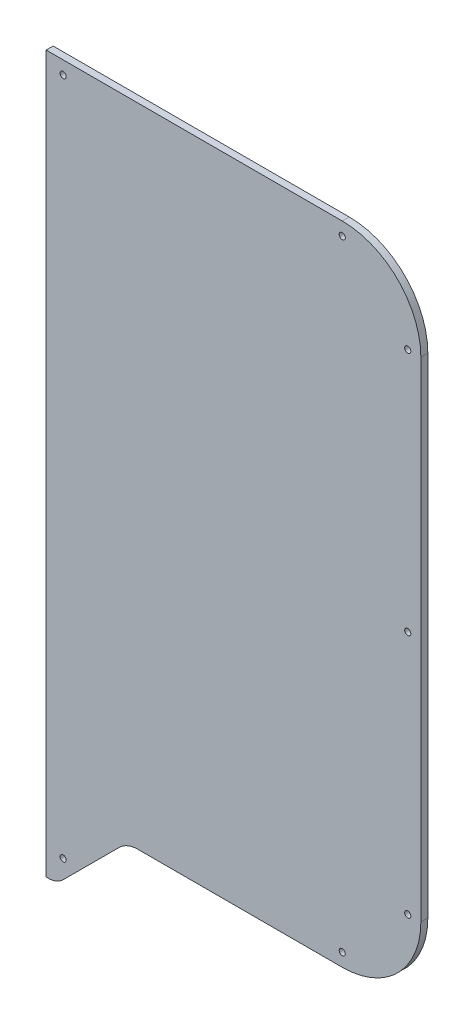
ISO-10303-21;
HEADER;
FILE_DESCRIPTION(('STEP AP214'),'2;1');
FILE_NAME('part.step','',(''),(''),'','','');
FILE_SCHEMA(('AUTOMOTIVE_DESIGN { 1 0 10303 214 1 1 1 1 }'));
ENDSEC;
DATA;
#1=APPLICATION_CONTEXT('core data for automotive mechanical design processes');
#2=APPLICATION_PROTOCOL_DEFINITION('international standard','automotive_design',2000,#1);
#3=PRODUCT_CONTEXT('',#1,'mechanical');
#4=PRODUCT('Part','Part','',(#3));
#5=PRODUCT_RELATED_PRODUCT_CATEGORY('part','',(#4));
#6=PRODUCT_DEFINITION_FORMATION('','',#4);
#7=PRODUCT_DEFINITION_CONTEXT('part definition',#1,'design');
#8=PRODUCT_DEFINITION('design','',#6,#7);
#9=PRODUCT_DEFINITION_SHAPE('','',#8);
#10=(LENGTH_UNIT() NAMED_UNIT(*) SI_UNIT(.MILLI.,.METRE.));
#11=(NAMED_UNIT(*) PLANE_ANGLE_UNIT() SI_UNIT($,.RADIAN.));
#12=(NAMED_UNIT(*) SI_UNIT($,.STERADIAN.) SOLID_ANGLE_UNIT());
#13=UNCERTAINTY_MEASURE_WITH_UNIT(LENGTH_MEASURE(1.E-05),#10,'distance_accuracy_value','');
#14=(GEOMETRIC_REPRESENTATION_CONTEXT(3) GLOBAL_UNCERTAINTY_ASSIGNED_CONTEXT((#13)) GLOBAL_UNIT_ASSIGNED_CONTEXT((#10,
#11,#12)) REPRESENTATION_CONTEXT('',''));
#15=CARTESIAN_POINT('',(0.,0.,0.));
#16=DIRECTION('',(0.,0.,1.));
#17=DIRECTION('',(1.,0.,0.));
#18=AXIS2_PLACEMENT_3D('',#15,#16,#17);
#19=CARTESIAN_POINT('',(2025.56407803921,-8.38997018521815,4.));
#20=DIRECTION('',(0.,0.,-1.));
#21=DIRECTION('',(-1.,0.,0.));
#22=AXIS2_PLACEMENT_3D('',#19,#20,#21);
#23=PLANE('',#22);
#24=CARTESIAN_POINT('',(2193.82169988618,382.110029814783,4.));
#25=DIRECTION('',(0.,0.,1.));
#26=DIRECTION('',(1.,0.,0.));
#27=AXIS2_PLACEMENT_3D('',#24,#25,#26);
#28=CIRCLE('',#27,1.75000000000009);
#29=CARTESIAN_POINT('',(2195.57169988618,382.110029814783,4.));
#30=VERTEX_POINT('',#29);
#31=EDGE_CURVE('E236',#30,#30,#28,.T.);
#32=ORIENTED_EDGE('',*,*,#31,.F.);
#33=EDGE_LOOP('',(#32));
#34=FACE_BOUND('',#33,.T.);
#35=CARTESIAN_POINT('',(2231.32169988618,204.610029814782,4.));
#36=DIRECTION('',(0.,0.,1.));
#37=DIRECTION('',(1.,0.,0.));
#38=AXIS2_PLACEMENT_3D('',#35,#36,#37);
#39=CIRCLE('',#38,1.75000000000008);
#40=CARTESIAN_POINT('',(2233.07169988618,204.610029814782,4.));
#41=VERTEX_POINT('',#40);
#42=EDGE_CURVE('E224',#41,#41,#39,.T.);
#43=ORIENTED_EDGE('',*,*,#42,.F.);
#44=EDGE_LOOP('',(#43));
#45=FACE_BOUND('',#44,.T.);
#46=CARTESIAN_POINT('',(2193.82169988618,27.1100298147812,4.));
#47=DIRECTION('',(0.,0.,1.));
#48=DIRECTION('',(1.,0.,0.));
#49=AXIS2_PLACEMENT_3D('',#46,#47,#48);
#50=CIRCLE('',#49,1.75000000000008);
#51=CARTESIAN_POINT('',(2195.57169988618,27.1100298147812,4.));
#52=VERTEX_POINT('',#51);
#53=EDGE_CURVE('E212',#52,#52,#50,.T.);
#54=ORIENTED_EDGE('',*,*,#53,.F.);
#55=EDGE_LOOP('',(#54));
#56=FACE_BOUND('',#55,.T.);
#57=DIRECTION('',(0.,-1.,0.));
#58=VECTOR('',#57,1.);
#59=CARTESIAN_POINT('',(2024.32169988618,389.610029814783,4.));
#60=LINE('',#59,#58);
#61=CARTESIAN_POINT('',(2024.32169988618,389.610029814783,4.));
#62=VERTEX_POINT('',#61);
#63=CARTESIAN_POINT('',(2024.32169988618,-20.3899701852181,4.));
#64=VERTEX_POINT('',#63);
#65=EDGE_CURVE('E161',#62,#64,#60,.T.);
#66=ORIENTED_EDGE('',*,*,#65,.T.);
#67=DIRECTION('',(1.,0.,0.));
#68=VECTOR('',#67,1.);
#69=CARTESIAN_POINT('',(2024.32169988618,-20.3899701852181,4.));
#70=LINE('',#69,#68);
#71=CARTESIAN_POINT('',(2025.56407803921,-20.3899701852181,4.));
#72=VERTEX_POINT('',#71);
#73=EDGE_CURVE('E99',#64,#72,#70,.T.);
#74=ORIENTED_EDGE('',*,*,#73,.T.);
#75=CARTESIAN_POINT('',(2025.56407803921,-8.38997018521815,4.));
#76=DIRECTION('',(0.,0.,1.));
#77=DIRECTION('',(-1.,0.,0.));
#78=AXIS2_PLACEMENT_3D('',#75,#76,#77);
#79=CIRCLE('',#78,11.9999999999999);
#80=CARTESIAN_POINT('',(2034.04809165281,-16.8765191307055,4.));
#81=VERTEX_POINT('',#80);
#82=EDGE_CURVE('E182',#72,#81,#79,.T.);
#83=ORIENTED_EDGE('',*,*,#82,.T.);
#84=DIRECTION('',(0.707212412123942,0.707001134467149,0.));
#85=VECTOR('',#84,1.);
#86=CARTESIAN_POINT('',(2034.04809165281,-16.8765191307054,4.));
#87=LINE('',#86,#85);
#88=CARTESIAN_POINT('',(2066.15241785449,15.2182159966403,4.));
#89=VERTEX_POINT('',#88);
#90=EDGE_CURVE('E201',#81,#89,#87,.T.);
#91=ORIENTED_EDGE('',*,*,#90,.T.);
#92=CARTESIAN_POINT('',(2076.7574348715,4.61002981478106,4.));
#93=DIRECTION('',(0.,0.,-1.));
#94=DIRECTION('',(1.,0.,0.));
#95=AXIS2_PLACEMENT_3D('',#92,#93,#94);
#96=CIRCLE('',#95,15.0000000000001);
#97=CARTESIAN_POINT('',(2076.7574348715,19.6100298147811,4.));
#98=VERTEX_POINT('',#97);
#99=EDGE_CURVE('E198',#89,#98,#96,.T.);
#100=ORIENTED_EDGE('',*,*,#99,.T.);
#101=DIRECTION('',(1.,0.,0.));
#102=VECTOR('',#101,1.);
#103=CARTESIAN_POINT('',(2076.7574348715,19.6100298147811,4.));
#104=LINE('',#103,#102);
#105=CARTESIAN_POINT('',(2193.82169988618,19.6100298147812,4.));
#106=VERTEX_POINT('',#105);
#107=EDGE_CURVE('E200',#98,#106,#104,.T.);
#108=ORIENTED_EDGE('',*,*,#107,.T.);
#109=CARTESIAN_POINT('',(2193.82169988618,64.6100298147811,4.));
#110=DIRECTION('',(0.,0.,1.));
#111=DIRECTION('',(1.,0.,0.));
#112=AXIS2_PLACEMENT_3D('',#109,#110,#111);
#113=CIRCLE('',#112,44.9999999999999);
#114=CARTESIAN_POINT('',(2238.82169988618,64.6100298147813,4.));
#115=VERTEX_POINT('',#114);
#116=EDGE_CURVE('E124',#106,#115,#113,.T.);
#117=ORIENTED_EDGE('',*,*,#116,.T.);
#118=DIRECTION('',(0.,1.,0.));
#119=VECTOR('',#118,1.);
#120=CARTESIAN_POINT('',(2238.82169988618,64.6100298147813,4.));
#121=LINE('',#120,#119);
#122=CARTESIAN_POINT('',(2238.82169988618,344.610029814783,4.));
#123=VERTEX_POINT('',#122);
#124=EDGE_CURVE('E118',#115,#123,#121,.T.);
#125=ORIENTED_EDGE('',*,*,#124,.T.);
#126=CARTESIAN_POINT('',(2193.82169988618,344.610029814783,4.));
#127=DIRECTION('',(0.,0.,1.));
#128=DIRECTION('',(1.,0.,0.));
#129=AXIS2_PLACEMENT_3D('',#126,#127,#128);
#130=CIRCLE('',#129,45.);
#131=CARTESIAN_POINT('',(2193.82169988618,389.610029814783,4.));
#132=VERTEX_POINT('',#131);
#133=EDGE_CURVE('E122',#123,#132,#130,.T.);
#134=ORIENTED_EDGE('',*,*,#133,.T.);
#135=DIRECTION('',(-1.,0.,0.));
#136=VECTOR('',#135,1.);
#137=CARTESIAN_POINT('',(2193.82169988618,389.610029814783,4.));
#138=LINE('',#137,#136);
#139=EDGE_CURVE('E50',#132,#62,#138,.T.);
#140=ORIENTED_EDGE('',*,*,#139,.T.);
#141=EDGE_LOOP('',(#66,#74,#83,#91,#100,#108,#117,#125,#134,#140));
#142=FACE_BOUND('',#141,.T.);
#143=CARTESIAN_POINT('',(2034.04809165281,-6.27150164030875,4.));
#144=DIRECTION('',(0.,0.,1.));
#145=DIRECTION('',(1.,0.,0.));
#146=AXIS2_PLACEMENT_3D('',#143,#144,#145);
#147=CIRCLE('',#146,1.75000000000008);
#148=CARTESIAN_POINT('',(2035.79809165281,-6.27150164030875,4.));
#149=VERTEX_POINT('',#148);
#150=EDGE_CURVE('E146',#149,#149,#147,.T.);
#151=ORIENTED_EDGE('',*,*,#150,.F.);
#152=EDGE_LOOP('',(#151));
#153=FACE_BOUND('',#152,.T.);
#154=CARTESIAN_POINT('',(2231.32169988618,64.6100298147813,4.));
#155=DIRECTION('',(0.,0.,1.));
#156=DIRECTION('',(1.,0.,0.));
#157=AXIS2_PLACEMENT_3D('',#154,#155,#156);
#158=CIRCLE('',#157,1.75000000000008);
#159=CARTESIAN_POINT('',(2233.07169988618,64.6100298147813,4.));
#160=VERTEX_POINT('',#159);
#161=EDGE_CURVE('E218',#160,#160,#158,.T.);
#162=ORIENTED_EDGE('',*,*,#161,.F.);
#163=EDGE_LOOP('',(#162));
#164=FACE_BOUND('',#163,.T.);
#165=CARTESIAN_POINT('',(2231.32169988618,344.610029814783,4.));
#166=DIRECTION('',(0.,0.,1.));
#167=DIRECTION('',(1.,0.,0.));
#168=AXIS2_PLACEMENT_3D('',#165,#166,#167);
#169=CIRCLE('',#168,1.75000000000009);
#170=CARTESIAN_POINT('',(2233.07169988618,344.610029814783,4.));
#171=VERTEX_POINT('',#170);
#172=EDGE_CURVE('E230',#171,#171,#169,.T.);
#173=ORIENTED_EDGE('',*,*,#172,.F.);
#174=EDGE_LOOP('',(#173));
#175=FACE_BOUND('',#174,.T.);
#176=CARTESIAN_POINT('',(2034.04809165281,382.110029814783,4.));
#177=DIRECTION('',(0.,0.,1.));
#178=DIRECTION('',(1.,0.,0.));
#179=AXIS2_PLACEMENT_3D('',#176,#177,#178);
#180=CIRCLE('',#179,1.75000000000009);
#181=CARTESIAN_POINT('',(2035.79809165281,382.110029814783,4.));
#182=VERTEX_POINT('',#181);
#183=EDGE_CURVE('E242',#182,#182,#180,.T.);
#184=ORIENTED_EDGE('',*,*,#183,.F.);
#185=EDGE_LOOP('',(#184));
#186=FACE_BOUND('',#185,.T.);
#187=ADVANCED_FACE('F33',(#34,#45,#56,#142,#153,#164,#175,#186),#23,.F.);
#188=CARTESIAN_POINT('',(2025.56407803921,-8.38997018521815,0.));
#189=DIRECTION('',(0.,0.,-1.));
#190=DIRECTION('',(-1.,0.,0.));
#191=AXIS2_PLACEMENT_3D('',#188,#189,#190);
#192=PLANE('',#191);
#193=CARTESIAN_POINT('',(2193.82169988618,382.110029814783,0.));
#194=DIRECTION('',(0.,0.,1.));
#195=DIRECTION('',(1.,0.,0.));
#196=AXIS2_PLACEMENT_3D('',#193,#194,#195);
#197=CIRCLE('',#196,1.75000000000009);
#198=CARTESIAN_POINT('',(2195.57169988618,382.110029814783,0.));
#199=VERTEX_POINT('',#198);
#200=EDGE_CURVE('E239',#199,#199,#197,.T.);
#201=ORIENTED_EDGE('',*,*,#200,.T.);
#202=EDGE_LOOP('',(#201));
#203=FACE_BOUND('',#202,.T.);
#204=CARTESIAN_POINT('',(2231.32169988618,204.610029814782,0.));
#205=DIRECTION('',(0.,0.,1.));
#206=DIRECTION('',(1.,0.,0.));
#207=AXIS2_PLACEMENT_3D('',#204,#205,#206);
#208=CIRCLE('',#207,1.75000000000008);
#209=CARTESIAN_POINT('',(2233.07169988618,204.610029814782,0.));
#210=VERTEX_POINT('',#209);
#211=EDGE_CURVE('E227',#210,#210,#208,.T.);
#212=ORIENTED_EDGE('',*,*,#211,.T.);
#213=EDGE_LOOP('',(#212));
#214=FACE_BOUND('',#213,.T.);
#215=CARTESIAN_POINT('',(2193.82169988618,27.1100298147812,0.));
#216=DIRECTION('',(0.,0.,1.));
#217=DIRECTION('',(1.,0.,0.));
#218=AXIS2_PLACEMENT_3D('',#215,#216,#217);
#219=CIRCLE('',#218,1.75000000000008);
#220=CARTESIAN_POINT('',(2195.57169988618,27.1100298147812,0.));
#221=VERTEX_POINT('',#220);
#222=EDGE_CURVE('E215',#221,#221,#219,.T.);
#223=ORIENTED_EDGE('',*,*,#222,.T.);
#224=EDGE_LOOP('',(#223));
#225=FACE_BOUND('',#224,.T.);
#226=DIRECTION('',(0.,-1.,0.));
#227=VECTOR('',#226,1.);
#228=CARTESIAN_POINT('',(2024.32169988618,389.610029814783,0.));
#229=LINE('',#228,#227);
#230=CARTESIAN_POINT('',(2024.32169988618,389.610029814783,0.));
#231=VERTEX_POINT('',#230);
#232=CARTESIAN_POINT('',(2024.32169988618,-20.3899701852181,0.));
#233=VERTEX_POINT('',#232);
#234=EDGE_CURVE('E142',#231,#233,#229,.T.);
#235=ORIENTED_EDGE('',*,*,#234,.F.);
#236=DIRECTION('',(-1.,0.,0.));
#237=VECTOR('',#236,1.);
#238=CARTESIAN_POINT('',(2193.82169988618,389.610029814783,0.));
#239=LINE('',#238,#237);
#240=CARTESIAN_POINT('',(2193.82169988618,389.610029814783,0.));
#241=VERTEX_POINT('',#240);
#242=EDGE_CURVE('E91',#241,#231,#239,.T.);
#243=ORIENTED_EDGE('',*,*,#242,.F.);
#244=CARTESIAN_POINT('',(2193.82169988618,344.610029814783,0.));
#245=DIRECTION('',(0.,0.,1.));
#246=DIRECTION('',(1.,0.,0.));
#247=AXIS2_PLACEMENT_3D('',#244,#245,#246);
#248=CIRCLE('',#247,45.);
#249=CARTESIAN_POINT('',(2238.82169988618,344.610029814783,0.));
#250=VERTEX_POINT('',#249);
#251=EDGE_CURVE('E85',#250,#241,#248,.T.);
#252=ORIENTED_EDGE('',*,*,#251,.F.);
#253=DIRECTION('',(0.,1.,0.));
#254=VECTOR('',#253,1.);
#255=CARTESIAN_POINT('',(2238.82169988618,64.6100298147813,0.));
#256=LINE('',#255,#254);
#257=CARTESIAN_POINT('',(2238.82169988618,64.6100298147813,0.));
#258=VERTEX_POINT('',#257);
#259=EDGE_CURVE('E132',#258,#250,#256,.T.);
#260=ORIENTED_EDGE('',*,*,#259,.F.);
#261=CARTESIAN_POINT('',(2193.82169988618,64.6100298147811,0.));
#262=DIRECTION('',(0.,0.,1.));
#263=DIRECTION('',(1.,0.,0.));
#264=AXIS2_PLACEMENT_3D('',#261,#262,#263);
#265=CIRCLE('',#264,44.9999999999999);
#266=CARTESIAN_POINT('',(2193.82169988618,19.6100298147812,0.));
#267=VERTEX_POINT('',#266);
#268=EDGE_CURVE('E156',#267,#258,#265,.T.);
#269=ORIENTED_EDGE('',*,*,#268,.F.);
#270=DIRECTION('',(1.,0.,0.));
#271=VECTOR('',#270,1.);
#272=CARTESIAN_POINT('',(2076.7574348715,19.6100298147811,0.));
#273=LINE('',#272,#271);
#274=CARTESIAN_POINT('',(2076.7574348715,19.6100298147811,0.));
#275=VERTEX_POINT('',#274);
#276=EDGE_CURVE('E154',#275,#267,#273,.T.);
#277=ORIENTED_EDGE('',*,*,#276,.F.);
#278=CARTESIAN_POINT('',(2076.7574348715,4.61002981478106,0.));
#279=DIRECTION('',(0.,0.,-1.));
#280=DIRECTION('',(1.,0.,0.));
#281=AXIS2_PLACEMENT_3D('',#278,#279,#280);
#282=CIRCLE('',#281,15.0000000000001);
#283=CARTESIAN_POINT('',(2066.15241785449,15.2182159966403,0.));
#284=VERTEX_POINT('',#283);
#285=EDGE_CURVE('E152',#284,#275,#282,.T.);
#286=ORIENTED_EDGE('',*,*,#285,.F.);
#287=DIRECTION('',(0.707212412123942,0.707001134467149,0.));
#288=VECTOR('',#287,1.);
#289=CARTESIAN_POINT('',(2034.04809165281,-16.8765191307054,0.));
#290=LINE('',#289,#288);
#291=CARTESIAN_POINT('',(2034.04809165281,-16.8765191307055,0.));
#292=VERTEX_POINT('',#291);
#293=EDGE_CURVE('E150',#292,#284,#290,.T.);
#294=ORIENTED_EDGE('',*,*,#293,.F.);
#295=CARTESIAN_POINT('',(2025.56407803921,-8.38997018521815,0.));
#296=DIRECTION('',(0.,0.,1.));
#297=DIRECTION('',(-1.,0.,0.));
#298=AXIS2_PLACEMENT_3D('',#295,#296,#297);
#299=CIRCLE('',#298,11.9999999999999);
#300=CARTESIAN_POINT('',(2025.56407803921,-20.3899701852181,0.));
#301=VERTEX_POINT('',#300);
#302=EDGE_CURVE('E148',#301,#292,#299,.T.);
#303=ORIENTED_EDGE('',*,*,#302,.F.);
#304=DIRECTION('',(1.,0.,0.));
#305=VECTOR('',#304,1.);
#306=CARTESIAN_POINT('',(2024.32169988618,-20.3899701852181,0.));
#307=LINE('',#306,#305);
#308=EDGE_CURVE('E145',#233,#301,#307,.T.);
#309=ORIENTED_EDGE('',*,*,#308,.F.);
#310=EDGE_LOOP('',(#235,#243,#252,#260,#269,#277,#286,#294,#303,#309));
#311=FACE_BOUND('',#310,.T.);
#312=CARTESIAN_POINT('',(2034.04809165281,-6.27150164030875,0.));
#313=DIRECTION('',(0.,0.,1.));
#314=DIRECTION('',(1.,0.,0.));
#315=AXIS2_PLACEMENT_3D('',#312,#313,#314);
#316=CIRCLE('',#315,1.75000000000008);
#317=CARTESIAN_POINT('',(2035.79809165281,-6.27150164030875,0.));
#318=VERTEX_POINT('',#317);
#319=EDGE_CURVE('E209',#318,#318,#316,.T.);
#320=ORIENTED_EDGE('',*,*,#319,.T.);
#321=EDGE_LOOP('',(#320));
#322=FACE_BOUND('',#321,.T.);
#323=CARTESIAN_POINT('',(2231.32169988618,64.6100298147813,0.));
#324=DIRECTION('',(0.,0.,1.));
#325=DIRECTION('',(1.,0.,0.));
#326=AXIS2_PLACEMENT_3D('',#323,#324,#325);
#327=CIRCLE('',#326,1.75000000000008);
#328=CARTESIAN_POINT('',(2233.07169988618,64.6100298147813,0.));
#329=VERTEX_POINT('',#328);
#330=EDGE_CURVE('E221',#329,#329,#327,.T.);
#331=ORIENTED_EDGE('',*,*,#330,.T.);
#332=EDGE_LOOP('',(#331));
#333=FACE_BOUND('',#332,.T.);
#334=CARTESIAN_POINT('',(2231.32169988618,344.610029814783,0.));
#335=DIRECTION('',(0.,0.,1.));
#336=DIRECTION('',(1.,0.,0.));
#337=AXIS2_PLACEMENT_3D('',#334,#335,#336);
#338=CIRCLE('',#337,1.75000000000009);
#339=CARTESIAN_POINT('',(2233.07169988618,344.610029814783,0.));
#340=VERTEX_POINT('',#339);
#341=EDGE_CURVE('E233',#340,#340,#338,.T.);
#342=ORIENTED_EDGE('',*,*,#341,.T.);
#343=EDGE_LOOP('',(#342));
#344=FACE_BOUND('',#343,.T.);
#345=CARTESIAN_POINT('',(2034.04809165281,382.110029814783,0.));
#346=DIRECTION('',(0.,0.,1.));
#347=DIRECTION('',(1.,0.,0.));
#348=AXIS2_PLACEMENT_3D('',#345,#346,#347);
#349=CIRCLE('',#348,1.75000000000009);
#350=CARTESIAN_POINT('',(2035.79809165281,382.110029814783,0.));
#351=VERTEX_POINT('',#350);
#352=EDGE_CURVE('E245',#351,#351,#349,.T.);
#353=ORIENTED_EDGE('',*,*,#352,.T.);
#354=EDGE_LOOP('',(#353));
#355=FACE_BOUND('',#354,.T.);
#356=ADVANCED_FACE('F186',(#203,#214,#225,#311,#322,#333,#344,#355),#192,.T.);
#357=CARTESIAN_POINT('',(2024.32169988618,389.610029814783,4.));
#358=DIRECTION('',(1.,0.,0.));
#359=DIRECTION('',(0.,0.,-1.));
#360=AXIS2_PLACEMENT_3D('',#357,#358,#359);
#361=PLANE('',#360);
#362=ORIENTED_EDGE('',*,*,#234,.T.);
#363=DIRECTION('',(0.,0.,-1.));
#364=VECTOR('',#363,1.);
#365=CARTESIAN_POINT('',(2024.32169988618,-20.3899701852181,4.));
#366=LINE('',#365,#364);
#367=EDGE_CURVE('E11',#64,#233,#366,.T.);
#368=ORIENTED_EDGE('',*,*,#367,.F.);
#369=ORIENTED_EDGE('',*,*,#65,.F.);
#370=DIRECTION('',(0.,0.,-1.));
#371=VECTOR('',#370,1.);
#372=CARTESIAN_POINT('',(2024.32169988618,389.610029814783,4.));
#373=LINE('',#372,#371);
#374=EDGE_CURVE('E138',#62,#231,#373,.T.);
#375=ORIENTED_EDGE('',*,*,#374,.T.);
#376=EDGE_LOOP('',(#362,#368,#369,#375));
#377=FACE_BOUND('',#376,.T.);
#378=ADVANCED_FACE('F35',(#377),#361,.F.);
#379=CARTESIAN_POINT('',(2024.32169988618,-20.3899701852181,4.));
#380=DIRECTION('',(0.,1.,0.));
#381=DIRECTION('',(-1.,0.,0.));
#382=AXIS2_PLACEMENT_3D('',#379,#380,#381);
#383=PLANE('',#382);
#384=ORIENTED_EDGE('',*,*,#308,.T.);
#385=DIRECTION('',(0.,0.,-1.));
#386=VECTOR('',#385,1.);
#387=CARTESIAN_POINT('',(2025.56407803921,-20.3899701852181,4.));
#388=LINE('',#387,#386);
#389=EDGE_CURVE('E42',#72,#301,#388,.T.);
#390=ORIENTED_EDGE('',*,*,#389,.F.);
#391=ORIENTED_EDGE('',*,*,#73,.F.);
#392=ORIENTED_EDGE('',*,*,#367,.T.);
#393=EDGE_LOOP('',(#384,#390,#391,#392));
#394=FACE_BOUND('',#393,.T.);
#395=ADVANCED_FACE('F288',(#394),#383,.F.);
#396=CARTESIAN_POINT('',(2025.56407803921,-8.38997018521815,4.));
#397=DIRECTION('',(0.,0.,-1.));
#398=DIRECTION('',(-1.,0.,0.));
#399=AXIS2_PLACEMENT_3D('',#396,#397,#398);
#400=CYLINDRICAL_SURFACE('',#399,11.9999999999999);
#401=ORIENTED_EDGE('',*,*,#302,.T.);
#402=DIRECTION('',(0.,0.,-1.));
#403=VECTOR('',#402,1.);
#404=CARTESIAN_POINT('',(2034.04809165281,-16.8765191307055,4.));
#405=LINE('',#404,#403);
#406=EDGE_CURVE('E174',#81,#292,#405,.T.);
#407=ORIENTED_EDGE('',*,*,#406,.F.);
#408=ORIENTED_EDGE('',*,*,#82,.F.);
#409=ORIENTED_EDGE('',*,*,#389,.T.);
#410=EDGE_LOOP('',(#401,#407,#408,#409));
#411=FACE_BOUND('',#410,.T.);
#412=ADVANCED_FACE('F180',(#411),#400,.T.);
#413=CARTESIAN_POINT('',(2034.04809165281,-16.8765191307054,4.));
#414=DIRECTION('',(-0.707001134467149,0.707212412123942,0.));
#415=DIRECTION('',(-0.707212412123942,-0.707001134467149,0.));
#416=AXIS2_PLACEMENT_3D('',#413,#414,#415);
#417=PLANE('',#416);
#418=ORIENTED_EDGE('',*,*,#293,.T.);
#419=DIRECTION('',(0.,0.,-1.));
#420=VECTOR('',#419,1.);
#421=CARTESIAN_POINT('',(2066.15241785449,15.2182159966403,4.));
#422=LINE('',#421,#420);
#423=EDGE_CURVE('E171',#89,#284,#422,.T.);
#424=ORIENTED_EDGE('',*,*,#423,.F.);
#425=ORIENTED_EDGE('',*,*,#90,.F.);
#426=ORIENTED_EDGE('',*,*,#406,.T.);
#427=EDGE_LOOP('',(#418,#424,#425,#426));
#428=FACE_BOUND('',#427,.T.);
#429=ADVANCED_FACE('F192',(#428),#417,.F.);
#430=CARTESIAN_POINT('',(2076.7574348715,4.61002981478106,4.));
#431=DIRECTION('',(0.,0.,-1.));
#432=DIRECTION('',(-1.,0.,0.));
#433=AXIS2_PLACEMENT_3D('',#430,#431,#432);
#434=CYLINDRICAL_SURFACE('',#433,15.0000000000001);
#435=ORIENTED_EDGE('',*,*,#285,.T.);
#436=DIRECTION('',(0.,0.,-1.));
#437=VECTOR('',#436,1.);
#438=CARTESIAN_POINT('',(2076.7574348715,19.6100298147811,4.));
#439=LINE('',#438,#437);
#440=EDGE_CURVE('E168',#98,#275,#439,.T.);
#441=ORIENTED_EDGE('',*,*,#440,.F.);
#442=ORIENTED_EDGE('',*,*,#99,.F.);
#443=ORIENTED_EDGE('',*,*,#423,.T.);
#444=EDGE_LOOP('',(#435,#441,#442,#443));
#445=FACE_BOUND('',#444,.T.);
#446=ADVANCED_FACE('F196',(#445),#434,.F.);
#447=CARTESIAN_POINT('',(2076.7574348715,19.6100298147811,4.));
#448=DIRECTION('',(0.,1.,0.));
#449=DIRECTION('',(-1.,0.,0.));
#450=AXIS2_PLACEMENT_3D('',#447,#448,#449);
#451=PLANE('',#450);
#452=ORIENTED_EDGE('',*,*,#276,.T.);
#453=DIRECTION('',(0.,0.,-1.));
#454=VECTOR('',#453,1.);
#455=CARTESIAN_POINT('',(2193.82169988618,19.6100298147812,4.));
#456=LINE('',#455,#454);
#457=EDGE_CURVE('E165',#106,#267,#456,.T.);
#458=ORIENTED_EDGE('',*,*,#457,.F.);
#459=ORIENTED_EDGE('',*,*,#107,.F.);
#460=ORIENTED_EDGE('',*,*,#440,.T.);
#461=EDGE_LOOP('',(#452,#458,#459,#460));
#462=FACE_BOUND('',#461,.T.);
#463=ADVANCED_FACE('F278',(#462),#451,.F.);
#464=CARTESIAN_POINT('',(2193.82169988618,64.6100298147811,4.));
#465=DIRECTION('',(0.,0.,-1.));
#466=DIRECTION('',(-1.,0.,0.));
#467=AXIS2_PLACEMENT_3D('',#464,#465,#466);
#468=CYLINDRICAL_SURFACE('',#467,44.9999999999999);
#469=ORIENTED_EDGE('',*,*,#268,.T.);
#470=DIRECTION('',(0.,0.,-1.));
#471=VECTOR('',#470,1.);
#472=CARTESIAN_POINT('',(2238.82169988618,64.6100298147813,4.));
#473=LINE('',#472,#471);
#474=EDGE_CURVE('E133',#115,#258,#473,.T.);
#475=ORIENTED_EDGE('',*,*,#474,.F.);
#476=ORIENTED_EDGE('',*,*,#116,.F.);
#477=ORIENTED_EDGE('',*,*,#457,.T.);
#478=EDGE_LOOP('',(#469,#475,#476,#477));
#479=FACE_BOUND('',#478,.T.);
#480=ADVANCED_FACE('F275',(#479),#468,.T.);
#481=CARTESIAN_POINT('',(2238.82169988618,64.6100298147813,4.));
#482=DIRECTION('',(-1.,0.,0.));
#483=DIRECTION('',(0.,0.,1.));
#484=AXIS2_PLACEMENT_3D('',#481,#482,#483);
#485=PLANE('',#484);
#486=ORIENTED_EDGE('',*,*,#259,.T.);
#487=DIRECTION('',(0.,0.,-1.));
#488=VECTOR('',#487,1.);
#489=CARTESIAN_POINT('',(2238.82169988618,344.610029814783,4.));
#490=LINE('',#489,#488);
#491=EDGE_CURVE('E129',#123,#250,#490,.T.);
#492=ORIENTED_EDGE('',*,*,#491,.F.);
#493=ORIENTED_EDGE('',*,*,#124,.F.);
#494=ORIENTED_EDGE('',*,*,#474,.T.);
#495=EDGE_LOOP('',(#486,#492,#493,#494));
#496=FACE_BOUND('',#495,.T.);
#497=ADVANCED_FACE('F130',(#496),#485,.F.);
#498=CARTESIAN_POINT('',(2193.82169988618,344.610029814783,4.));
#499=DIRECTION('',(0.,0.,-1.));
#500=DIRECTION('',(-1.,0.,0.));
#501=AXIS2_PLACEMENT_3D('',#498,#499,#500);
#502=CYLINDRICAL_SURFACE('',#501,45.);
#503=ORIENTED_EDGE('',*,*,#251,.T.);
#504=DIRECTION('',(0.,0.,-1.));
#505=VECTOR('',#504,1.);
#506=CARTESIAN_POINT('',(2193.82169988618,389.610029814783,4.));
#507=LINE('',#506,#505);
#508=EDGE_CURVE('E134',#132,#241,#507,.T.);
#509=ORIENTED_EDGE('',*,*,#508,.F.);
#510=ORIENTED_EDGE('',*,*,#133,.F.);
#511=ORIENTED_EDGE('',*,*,#491,.T.);
#512=EDGE_LOOP('',(#503,#509,#510,#511));
#513=FACE_BOUND('',#512,.T.);
#514=ADVANCED_FACE('F136',(#513),#502,.T.);
#515=CARTESIAN_POINT('',(2193.82169988618,389.610029814783,4.));
#516=DIRECTION('',(0.,-1.,0.));
#517=DIRECTION('',(1.,0.,0.));
#518=AXIS2_PLACEMENT_3D('',#515,#516,#517);
#519=PLANE('',#518);
#520=ORIENTED_EDGE('',*,*,#242,.T.);
#521=ORIENTED_EDGE('',*,*,#374,.F.);
#522=ORIENTED_EDGE('',*,*,#139,.F.);
#523=ORIENTED_EDGE('',*,*,#508,.T.);
#524=EDGE_LOOP('',(#520,#521,#522,#523));
#525=FACE_BOUND('',#524,.T.);
#526=ADVANCED_FACE('F268',(#525),#519,.F.);
#527=CARTESIAN_POINT('',(2034.04809165281,-6.27150164030875,4.));
#528=DIRECTION('',(0.,0.,-1.));
#529=DIRECTION('',(-1.,0.,0.));
#530=AXIS2_PLACEMENT_3D('',#527,#528,#529);
#531=CYLINDRICAL_SURFACE('',#530,1.75000000000008);
#532=ORIENTED_EDGE('',*,*,#150,.T.);
#533=EDGE_LOOP('',(#532));
#534=FACE_BOUND('',#533,.T.);
#535=ORIENTED_EDGE('',*,*,#319,.F.);
#536=EDGE_LOOP('',(#535));
#537=FACE_BOUND('',#536,.T.);
#538=ADVANCED_FACE('F265',(#534,#537),#531,.F.);
#539=CARTESIAN_POINT('',(2193.82169988618,27.1100298147812,4.));
#540=DIRECTION('',(0.,0.,-1.));
#541=DIRECTION('',(-1.,0.,0.));
#542=AXIS2_PLACEMENT_3D('',#539,#540,#541);
#543=CYLINDRICAL_SURFACE('',#542,1.75000000000008);
#544=ORIENTED_EDGE('',*,*,#53,.T.);
#545=EDGE_LOOP('',(#544));
#546=FACE_BOUND('',#545,.T.);
#547=ORIENTED_EDGE('',*,*,#222,.F.);
#548=EDGE_LOOP('',(#547));
#549=FACE_BOUND('',#548,.T.);
#550=ADVANCED_FACE('F364',(#546,#549),#543,.F.);
#551=CARTESIAN_POINT('',(2231.32169988618,64.6100298147813,4.));
#552=DIRECTION('',(0.,0.,-1.));
#553=DIRECTION('',(-1.,0.,0.));
#554=AXIS2_PLACEMENT_3D('',#551,#552,#553);
#555=CYLINDRICAL_SURFACE('',#554,1.75000000000008);
#556=ORIENTED_EDGE('',*,*,#161,.T.);
#557=EDGE_LOOP('',(#556));
#558=FACE_BOUND('',#557,.T.);
#559=ORIENTED_EDGE('',*,*,#330,.F.);
#560=EDGE_LOOP('',(#559));
#561=FACE_BOUND('',#560,.T.);
#562=ADVANCED_FACE('F372',(#558,#561),#555,.F.);
#563=CARTESIAN_POINT('',(2231.32169988618,204.610029814782,4.));
#564=DIRECTION('',(0.,0.,-1.));
#565=DIRECTION('',(-1.,0.,0.));
#566=AXIS2_PLACEMENT_3D('',#563,#564,#565);
#567=CYLINDRICAL_SURFACE('',#566,1.75000000000008);
#568=ORIENTED_EDGE('',*,*,#42,.T.);
#569=EDGE_LOOP('',(#568));
#570=FACE_BOUND('',#569,.T.);
#571=ORIENTED_EDGE('',*,*,#211,.F.);
#572=EDGE_LOOP('',(#571));
#573=FACE_BOUND('',#572,.T.);
#574=ADVANCED_FACE('F380',(#570,#573),#567,.F.);
#575=CARTESIAN_POINT('',(2231.32169988618,344.610029814783,4.));
#576=DIRECTION('',(0.,0.,-1.));
#577=DIRECTION('',(-1.,0.,0.));
#578=AXIS2_PLACEMENT_3D('',#575,#576,#577);
#579=CYLINDRICAL_SURFACE('',#578,1.75000000000009);
#580=ORIENTED_EDGE('',*,*,#172,.T.);
#581=EDGE_LOOP('',(#580));
#582=FACE_BOUND('',#581,.T.);
#583=ORIENTED_EDGE('',*,*,#341,.F.);
#584=EDGE_LOOP('',(#583));
#585=FACE_BOUND('',#584,.T.);
#586=ADVANCED_FACE('F389',(#582,#585),#579,.F.);
#587=CARTESIAN_POINT('',(2193.82169988618,382.110029814783,4.));
#588=DIRECTION('',(0.,0.,-1.));
#589=DIRECTION('',(-1.,0.,0.));
#590=AXIS2_PLACEMENT_3D('',#587,#588,#589);
#591=CYLINDRICAL_SURFACE('',#590,1.75000000000009);
#592=ORIENTED_EDGE('',*,*,#31,.T.);
#593=EDGE_LOOP('',(#592));
#594=FACE_BOUND('',#593,.T.);
#595=ORIENTED_EDGE('',*,*,#200,.F.);
#596=EDGE_LOOP('',(#595));
#597=FACE_BOUND('',#596,.T.);
#598=ADVANCED_FACE('F398',(#594,#597),#591,.F.);
#599=CARTESIAN_POINT('',(2034.04809165281,382.110029814783,4.));
#600=DIRECTION('',(0.,0.,-1.));
#601=DIRECTION('',(-1.,0.,0.));
#602=AXIS2_PLACEMENT_3D('',#599,#600,#601);
#603=CYLINDRICAL_SURFACE('',#602,1.75000000000009);
#604=ORIENTED_EDGE('',*,*,#183,.T.);
#605=EDGE_LOOP('',(#604));
#606=FACE_BOUND('',#605,.T.);
#607=ORIENTED_EDGE('',*,*,#352,.F.);
#608=EDGE_LOOP('',(#607));
#609=FACE_BOUND('',#608,.T.);
#610=ADVANCED_FACE('F251',(#606,#609),#603,.F.);
#611=CLOSED_SHELL('',(#187,#356,#378,#395,#412,#429,#446,#463,#480,#497,#514,#526,#538,#550,
#562,#574,#586,#598,#610));
#612=MANIFOLD_SOLID_BREP('B2',#611);
#613=ADVANCED_BREP_SHAPE_REPRESENTATION('',(#18,#612),#14);
#614=SHAPE_DEFINITION_REPRESENTATION(#9,#613);
ENDSEC;
END-ISO-10303-21;
